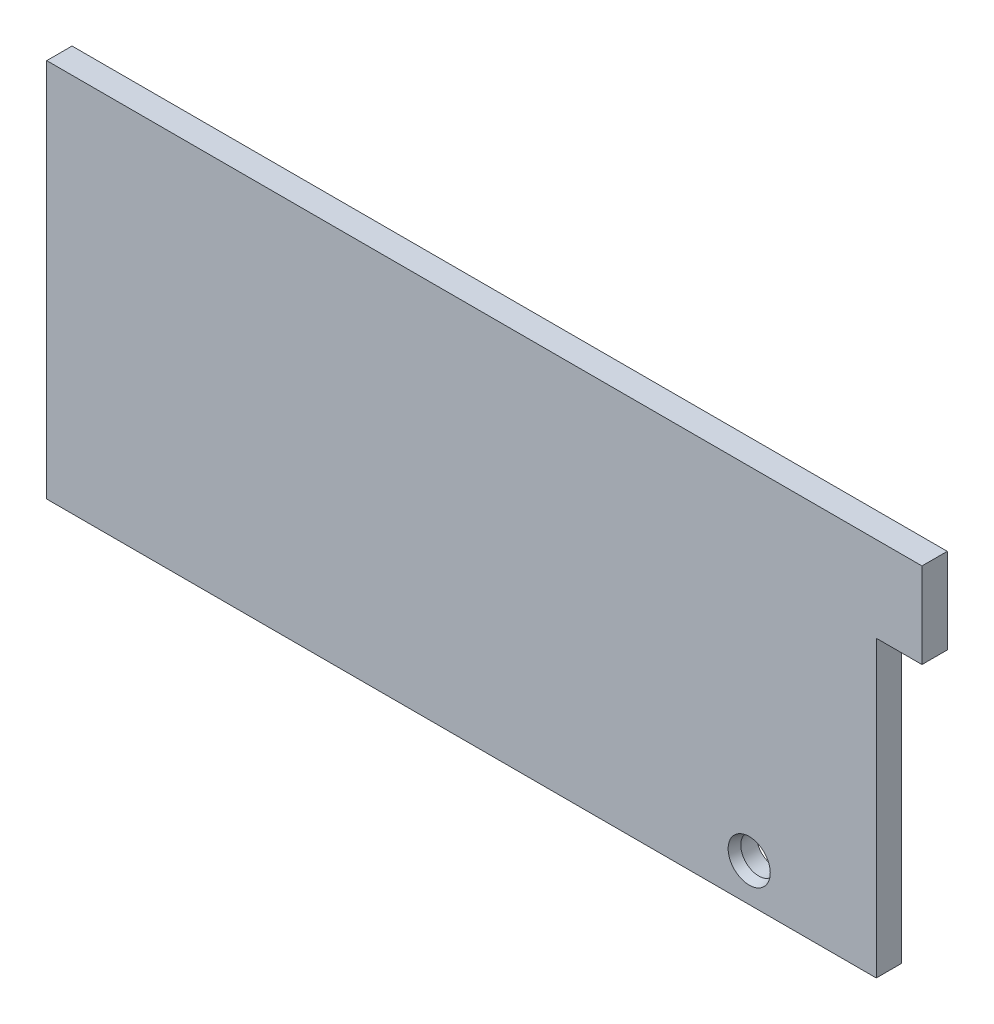
ISO-10303-21;
HEADER;
FILE_DESCRIPTION(('STEP AP214'),'2;1');
FILE_NAME('part.step','',(''),(''),'','','');
FILE_SCHEMA(('AUTOMOTIVE_DESIGN { 1 0 10303 214 1 1 1 1 }'));
ENDSEC;
DATA;
#1=APPLICATION_CONTEXT('core data for automotive mechanical design processes');
#2=APPLICATION_PROTOCOL_DEFINITION('international standard','automotive_design',2000,#1);
#3=PRODUCT_CONTEXT('',#1,'mechanical');
#4=PRODUCT('Part','Part','',(#3));
#5=PRODUCT_RELATED_PRODUCT_CATEGORY('part','',(#4));
#6=PRODUCT_DEFINITION_FORMATION('','',#4);
#7=PRODUCT_DEFINITION_CONTEXT('part definition',#1,'design');
#8=PRODUCT_DEFINITION('design','',#6,#7);
#9=PRODUCT_DEFINITION_SHAPE('','',#8);
#10=(LENGTH_UNIT() NAMED_UNIT(*) SI_UNIT(.MILLI.,.METRE.));
#11=(NAMED_UNIT(*) PLANE_ANGLE_UNIT() SI_UNIT($,.RADIAN.));
#12=(NAMED_UNIT(*) SI_UNIT($,.STERADIAN.) SOLID_ANGLE_UNIT());
#13=UNCERTAINTY_MEASURE_WITH_UNIT(LENGTH_MEASURE(1.E-05),#10,'distance_accuracy_value','');
#14=(GEOMETRIC_REPRESENTATION_CONTEXT(3) GLOBAL_UNCERTAINTY_ASSIGNED_CONTEXT((#13)) GLOBAL_UNIT_ASSIGNED_CONTEXT((#10,
#11,#12)) REPRESENTATION_CONTEXT('',''));
#15=CARTESIAN_POINT('',(0.,0.,0.));
#16=DIRECTION('',(0.,0.,1.));
#17=DIRECTION('',(1.,0.,0.));
#18=AXIS2_PLACEMENT_3D('',#15,#16,#17);
#19=CARTESIAN_POINT('',(0.,0.,2.));
#20=DIRECTION('',(0.,0.,1.));
#21=DIRECTION('',(1.,0.,0.));
#22=AXIS2_PLACEMENT_3D('',#19,#20,#21);
#23=PLANE('',#22);
#24=CARTESIAN_POINT('',(30.0000000000001,-24.,2.));
#25=DIRECTION('',(0.,0.,1.));
#26=DIRECTION('',(1.,0.,0.));
#27=AXIS2_PLACEMENT_3D('',#24,#25,#26);
#28=CIRCLE('',#27,3.33000000000001);
#29=CARTESIAN_POINT('',(33.3300000000001,-24.,2.));
#30=VERTEX_POINT('',#29);
#31=EDGE_CURVE('E11',#30,#30,#28,.F.);
#32=ORIENTED_EDGE('',*,*,#31,.T.);
#33=EDGE_LOOP('',(#32));
#34=FACE_BOUND('',#33,.T.);
#35=DIRECTION('',(0.,-1.,0.));
#36=VECTOR('',#35,1.);
#37=CARTESIAN_POINT('',(-81.,30.,2.));
#38=LINE('',#37,#36);
#39=CARTESIAN_POINT('',(-81.,30.,2.));
#40=VERTEX_POINT('',#39);
#41=CARTESIAN_POINT('',(-81.,-30.,2.));
#42=VERTEX_POINT('',#41);
#43=EDGE_CURVE('E134',#40,#42,#38,.T.);
#44=ORIENTED_EDGE('',*,*,#43,.T.);
#45=DIRECTION('',(1.,0.,0.));
#46=VECTOR('',#45,1.);
#47=CARTESIAN_POINT('',(-81.,-30.,2.));
#48=LINE('',#47,#46);
#49=CARTESIAN_POINT('',(50.0797363901881,-30.,2.));
#50=VERTEX_POINT('',#49);
#51=EDGE_CURVE('E93',#42,#50,#48,.T.);
#52=ORIENTED_EDGE('',*,*,#51,.T.);
#53=DIRECTION('',(0.,1.,0.));
#54=VECTOR('',#53,1.);
#55=CARTESIAN_POINT('',(50.0797363901881,16.5,2.));
#56=LINE('',#55,#54);
#57=CARTESIAN_POINT('',(50.0797363901881,16.5,2.));
#58=VERTEX_POINT('',#57);
#59=EDGE_CURVE('E105',#50,#58,#56,.T.);
#60=ORIENTED_EDGE('',*,*,#59,.T.);
#61=DIRECTION('',(1.,0.,0.));
#62=VECTOR('',#61,1.);
#63=CARTESIAN_POINT('',(57.3,16.5,2.));
#64=LINE('',#63,#62);
#65=CARTESIAN_POINT('',(57.3,16.5,2.));
#66=VERTEX_POINT('',#65);
#67=EDGE_CURVE('E100',#58,#66,#64,.T.);
#68=ORIENTED_EDGE('',*,*,#67,.T.);
#69=DIRECTION('',(0.,1.,0.));
#70=VECTOR('',#69,1.);
#71=CARTESIAN_POINT('',(57.3,16.5,2.));
#72=LINE('',#71,#70);
#73=CARTESIAN_POINT('',(57.3,30.,2.));
#74=VERTEX_POINT('',#73);
#75=EDGE_CURVE('E103',#66,#74,#72,.T.);
#76=ORIENTED_EDGE('',*,*,#75,.T.);
#77=DIRECTION('',(-1.,0.,0.));
#78=VECTOR('',#77,1.);
#79=CARTESIAN_POINT('',(57.3,30.,2.));
#80=LINE('',#79,#78);
#81=EDGE_CURVE('E55',#74,#40,#80,.T.);
#82=ORIENTED_EDGE('',*,*,#81,.T.);
#83=EDGE_LOOP('',(#44,#52,#60,#68,#76,#82));
#84=FACE_BOUND('',#83,.T.);
#85=ADVANCED_FACE('F37',(#34,#84),#23,.T.);
#86=CARTESIAN_POINT('',(0.,0.,-2.));
#87=DIRECTION('',(0.,0.,1.));
#88=DIRECTION('',(1.,0.,0.));
#89=AXIS2_PLACEMENT_3D('',#86,#87,#88);
#90=PLANE('',#89);
#91=DIRECTION('',(0.,-1.,0.));
#92=VECTOR('',#91,1.);
#93=CARTESIAN_POINT('',(-81.,30.,-2.));
#94=LINE('',#93,#92);
#95=CARTESIAN_POINT('',(-81.,30.,-2.));
#96=VERTEX_POINT('',#95);
#97=CARTESIAN_POINT('',(-81.,-30.,-2.));
#98=VERTEX_POINT('',#97);
#99=EDGE_CURVE('E123',#96,#98,#94,.T.);
#100=ORIENTED_EDGE('',*,*,#99,.F.);
#101=DIRECTION('',(-1.,0.,0.));
#102=VECTOR('',#101,1.);
#103=CARTESIAN_POINT('',(57.3,30.,-2.));
#104=LINE('',#103,#102);
#105=CARTESIAN_POINT('',(57.3,30.,-2.));
#106=VERTEX_POINT('',#105);
#107=EDGE_CURVE('E84',#106,#96,#104,.T.);
#108=ORIENTED_EDGE('',*,*,#107,.F.);
#109=DIRECTION('',(0.,1.,0.));
#110=VECTOR('',#109,1.);
#111=CARTESIAN_POINT('',(57.3,16.5,-2.));
#112=LINE('',#111,#110);
#113=CARTESIAN_POINT('',(57.3,16.5,-2.));
#114=VERTEX_POINT('',#113);
#115=EDGE_CURVE('E78',#114,#106,#112,.T.);
#116=ORIENTED_EDGE('',*,*,#115,.F.);
#117=DIRECTION('',(1.,0.,0.));
#118=VECTOR('',#117,1.);
#119=CARTESIAN_POINT('',(57.3,16.5,-2.));
#120=LINE('',#119,#118);
#121=CARTESIAN_POINT('',(50.0797363901881,16.5,-2.));
#122=VERTEX_POINT('',#121);
#123=EDGE_CURVE('E113',#122,#114,#120,.T.);
#124=ORIENTED_EDGE('',*,*,#123,.F.);
#125=DIRECTION('',(0.,1.,0.));
#126=VECTOR('',#125,1.);
#127=CARTESIAN_POINT('',(50.0797363901881,16.5,-2.));
#128=LINE('',#127,#126);
#129=CARTESIAN_POINT('',(50.0797363901881,-30.,-2.));
#130=VERTEX_POINT('',#129);
#131=EDGE_CURVE('E129',#130,#122,#128,.T.);
#132=ORIENTED_EDGE('',*,*,#131,.F.);
#133=DIRECTION('',(1.,0.,0.));
#134=VECTOR('',#133,1.);
#135=CARTESIAN_POINT('',(-81.,-30.,-2.));
#136=LINE('',#135,#134);
#137=EDGE_CURVE('E126',#98,#130,#136,.T.);
#138=ORIENTED_EDGE('',*,*,#137,.F.);
#139=EDGE_LOOP('',(#100,#108,#116,#124,#132,#138));
#140=FACE_BOUND('',#139,.T.);
#141=CARTESIAN_POINT('',(30.0000000000001,-24.,-2.));
#142=DIRECTION('',(0.,0.,1.));
#143=DIRECTION('',(1.,0.,0.));
#144=AXIS2_PLACEMENT_3D('',#141,#142,#143);
#145=CIRCLE('',#144,2.83);
#146=CARTESIAN_POINT('',(32.8300000000001,-24.,-2.));
#147=VERTEX_POINT('',#146);
#148=EDGE_CURVE('E127',#147,#147,#145,.T.);
#149=ORIENTED_EDGE('',*,*,#148,.T.);
#150=EDGE_LOOP('',(#149));
#151=FACE_BOUND('',#150,.T.);
#152=ADVANCED_FACE('F157',(#140,#151),#90,.F.);
#153=CARTESIAN_POINT('',(-81.,30.,2.));
#154=DIRECTION('',(1.,0.,0.));
#155=DIRECTION('',(0.,0.,-1.));
#156=AXIS2_PLACEMENT_3D('',#153,#154,#155);
#157=PLANE('',#156);
#158=ORIENTED_EDGE('',*,*,#99,.T.);
#159=DIRECTION('',(0.,0.,-1.));
#160=VECTOR('',#159,1.);
#161=CARTESIAN_POINT('',(-81.,-30.,2.));
#162=LINE('',#161,#160);
#163=EDGE_CURVE('E141',#42,#98,#162,.T.);
#164=ORIENTED_EDGE('',*,*,#163,.F.);
#165=ORIENTED_EDGE('',*,*,#43,.F.);
#166=DIRECTION('',(0.,0.,-1.));
#167=VECTOR('',#166,1.);
#168=CARTESIAN_POINT('',(-81.,30.,2.));
#169=LINE('',#168,#167);
#170=EDGE_CURVE('E119',#40,#96,#169,.T.);
#171=ORIENTED_EDGE('',*,*,#170,.T.);
#172=EDGE_LOOP('',(#158,#164,#165,#171));
#173=FACE_BOUND('',#172,.T.);
#174=ADVANCED_FACE('F163',(#173),#157,.F.);
#175=CARTESIAN_POINT('',(-81.,-30.,2.));
#176=DIRECTION('',(0.,1.,0.));
#177=DIRECTION('',(0.,0.,1.));
#178=AXIS2_PLACEMENT_3D('',#175,#176,#177);
#179=PLANE('',#178);
#180=ORIENTED_EDGE('',*,*,#137,.T.);
#181=DIRECTION('',(0.,0.,-1.));
#182=VECTOR('',#181,1.);
#183=CARTESIAN_POINT('',(50.0797363901881,-30.,2.));
#184=LINE('',#183,#182);
#185=EDGE_CURVE('E138',#50,#130,#184,.T.);
#186=ORIENTED_EDGE('',*,*,#185,.F.);
#187=ORIENTED_EDGE('',*,*,#51,.F.);
#188=ORIENTED_EDGE('',*,*,#163,.T.);
#189=EDGE_LOOP('',(#180,#186,#187,#188));
#190=FACE_BOUND('',#189,.T.);
#191=ADVANCED_FACE('F176',(#190),#179,.F.);
#192=CARTESIAN_POINT('',(50.0797363901881,16.5,2.));
#193=DIRECTION('',(-1.,0.,0.));
#194=DIRECTION('',(0.,0.,1.));
#195=AXIS2_PLACEMENT_3D('',#192,#193,#194);
#196=PLANE('',#195);
#197=ORIENTED_EDGE('',*,*,#131,.T.);
#198=DIRECTION('',(0.,0.,-1.));
#199=VECTOR('',#198,1.);
#200=CARTESIAN_POINT('',(50.0797363901881,16.5,2.));
#201=LINE('',#200,#199);
#202=EDGE_CURVE('E114',#58,#122,#201,.T.);
#203=ORIENTED_EDGE('',*,*,#202,.F.);
#204=ORIENTED_EDGE('',*,*,#59,.F.);
#205=ORIENTED_EDGE('',*,*,#185,.T.);
#206=EDGE_LOOP('',(#197,#203,#204,#205));
#207=FACE_BOUND('',#206,.T.);
#208=ADVANCED_FACE('F173',(#207),#196,.F.);
#209=CARTESIAN_POINT('',(57.3,16.5,2.));
#210=DIRECTION('',(0.,1.,0.));
#211=DIRECTION('',(0.,0.,1.));
#212=AXIS2_PLACEMENT_3D('',#209,#210,#211);
#213=PLANE('',#212);
#214=ORIENTED_EDGE('',*,*,#123,.T.);
#215=DIRECTION('',(0.,0.,-1.));
#216=VECTOR('',#215,1.);
#217=CARTESIAN_POINT('',(57.3,16.5,2.));
#218=LINE('',#217,#216);
#219=EDGE_CURVE('E110',#66,#114,#218,.T.);
#220=ORIENTED_EDGE('',*,*,#219,.F.);
#221=ORIENTED_EDGE('',*,*,#67,.F.);
#222=ORIENTED_EDGE('',*,*,#202,.T.);
#223=EDGE_LOOP('',(#214,#220,#221,#222));
#224=FACE_BOUND('',#223,.T.);
#225=ADVANCED_FACE('F111',(#224),#213,.F.);
#226=CARTESIAN_POINT('',(57.3,16.5,2.));
#227=DIRECTION('',(-1.,0.,0.));
#228=DIRECTION('',(0.,0.,1.));
#229=AXIS2_PLACEMENT_3D('',#226,#227,#228);
#230=PLANE('',#229);
#231=ORIENTED_EDGE('',*,*,#115,.T.);
#232=DIRECTION('',(0.,0.,-1.));
#233=VECTOR('',#232,1.);
#234=CARTESIAN_POINT('',(57.3,30.,2.));
#235=LINE('',#234,#233);
#236=EDGE_CURVE('E115',#74,#106,#235,.T.);
#237=ORIENTED_EDGE('',*,*,#236,.F.);
#238=ORIENTED_EDGE('',*,*,#75,.F.);
#239=ORIENTED_EDGE('',*,*,#219,.T.);
#240=EDGE_LOOP('',(#231,#237,#238,#239));
#241=FACE_BOUND('',#240,.T.);
#242=ADVANCED_FACE('F117',(#241),#230,.F.);
#243=CARTESIAN_POINT('',(57.3,30.,2.));
#244=DIRECTION('',(0.,-1.,0.));
#245=DIRECTION('',(0.,0.,-1.));
#246=AXIS2_PLACEMENT_3D('',#243,#244,#245);
#247=PLANE('',#246);
#248=ORIENTED_EDGE('',*,*,#107,.T.);
#249=ORIENTED_EDGE('',*,*,#170,.F.);
#250=ORIENTED_EDGE('',*,*,#81,.F.);
#251=ORIENTED_EDGE('',*,*,#236,.T.);
#252=EDGE_LOOP('',(#248,#249,#250,#251));
#253=FACE_BOUND('',#252,.T.);
#254=ADVANCED_FACE('F153',(#253),#247,.F.);
#255=CARTESIAN_POINT('',(30.0000000000001,-24.,2.));
#256=DIRECTION('',(0.,0.,-1.));
#257=DIRECTION('',(-1.,0.,0.));
#258=AXIS2_PLACEMENT_3D('',#255,#256,#257);
#259=CYLINDRICAL_SURFACE('',#258,2.83);
#260=CARTESIAN_POINT('',(30.0000000000001,-24.,0.499999999999959));
#261=DIRECTION('',(0.,0.,1.));
#262=DIRECTION('',(1.,0.,0.));
#263=AXIS2_PLACEMENT_3D('',#260,#261,#262);
#264=CIRCLE('',#263,2.83);
#265=CARTESIAN_POINT('',(32.8300000000001,-24.,0.499999999999959));
#266=VERTEX_POINT('',#265);
#267=EDGE_CURVE('E47',#266,#266,#264,.T.);
#268=ORIENTED_EDGE('',*,*,#267,.T.);
#269=EDGE_LOOP('',(#268));
#270=FACE_BOUND('',#269,.T.);
#271=ORIENTED_EDGE('',*,*,#148,.F.);
#272=EDGE_LOOP('',(#271));
#273=FACE_BOUND('',#272,.T.);
#274=ADVANCED_FACE('F145',(#270,#273),#259,.F.);
#275=CARTESIAN_POINT('',(30.0000000000001,-24.,0.499999999999959));
#276=DIRECTION('',(0.,0.,1.));
#277=DIRECTION('',(1.,0.,0.));
#278=AXIS2_PLACEMENT_3D('',#275,#276,#277);
#279=CONICAL_SURFACE('',#278,2.83,0.321750554396639);
#280=ORIENTED_EDGE('',*,*,#31,.F.);
#281=EDGE_LOOP('',(#280));
#282=FACE_BOUND('',#281,.T.);
#283=ORIENTED_EDGE('',*,*,#267,.F.);
#284=EDGE_LOOP('',(#283));
#285=FACE_BOUND('',#284,.T.);
#286=ADVANCED_FACE('F40',(#282,#285),#279,.F.);
#287=CLOSED_SHELL('',(#85,#152,#174,#191,#208,#225,#242,#254,#274,#286));
#288=MANIFOLD_SOLID_BREP('B2',#287);
#289=ADVANCED_BREP_SHAPE_REPRESENTATION('',(#18,#288),#14);
#290=SHAPE_DEFINITION_REPRESENTATION(#9,#289);
ENDSEC;
END-ISO-10303-21;
